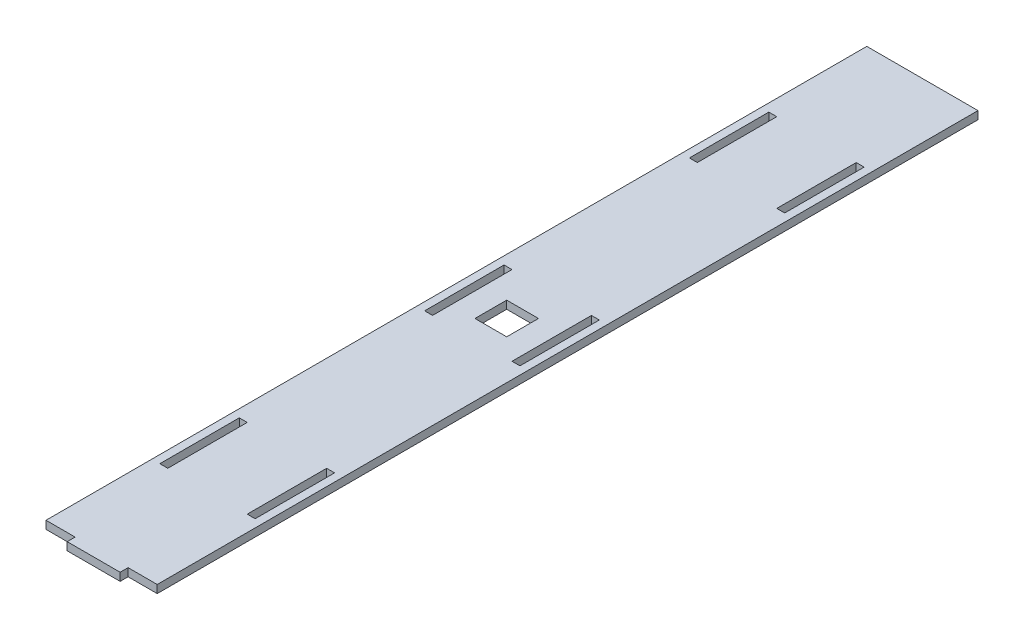
ISO-10303-21;
HEADER;
FILE_DESCRIPTION(('STEP AP214'),'2;1');
FILE_NAME('part.step','',(''),(''),'','','');
FILE_SCHEMA(('AUTOMOTIVE_DESIGN { 1 0 10303 214 1 1 1 1 }'));
ENDSEC;
DATA;
#1=APPLICATION_CONTEXT('core data for automotive mechanical design processes');
#2=APPLICATION_PROTOCOL_DEFINITION('international standard','automotive_design',2000,#1);
#3=PRODUCT_CONTEXT('',#1,'mechanical');
#4=PRODUCT('Part','Part','',(#3));
#5=PRODUCT_RELATED_PRODUCT_CATEGORY('part','',(#4));
#6=PRODUCT_DEFINITION_FORMATION('','',#4);
#7=PRODUCT_DEFINITION_CONTEXT('part definition',#1,'design');
#8=PRODUCT_DEFINITION('design','',#6,#7);
#9=PRODUCT_DEFINITION_SHAPE('','',#8);
#10=(LENGTH_UNIT() NAMED_UNIT(*) SI_UNIT(.MILLI.,.METRE.));
#11=(NAMED_UNIT(*) PLANE_ANGLE_UNIT() SI_UNIT($,.RADIAN.));
#12=(NAMED_UNIT(*) SI_UNIT($,.STERADIAN.) SOLID_ANGLE_UNIT());
#13=UNCERTAINTY_MEASURE_WITH_UNIT(LENGTH_MEASURE(1.E-05),#10,'distance_accuracy_value','');
#14=(GEOMETRIC_REPRESENTATION_CONTEXT(3) GLOBAL_UNCERTAINTY_ASSIGNED_CONTEXT((#13)) GLOBAL_UNIT_ASSIGNED_CONTEXT((#10,
#11,#12)) REPRESENTATION_CONTEXT('',''));
#15=CARTESIAN_POINT('',(0.,0.,0.));
#16=DIRECTION('',(0.,0.,1.));
#17=DIRECTION('',(1.,0.,0.));
#18=AXIS2_PLACEMENT_3D('',#15,#16,#17);
#19=CARTESIAN_POINT('',(0.,3.,0.));
#20=DIRECTION('',(0.,-1.,0.));
#21=DIRECTION('',(0.,0.,-1.));
#22=AXIS2_PLACEMENT_3D('',#19,#20,#21);
#23=PLANE('',#22);
#24=DIRECTION('',(-1.,0.,0.));
#25=VECTOR('',#24,1.);
#26=CARTESIAN_POINT('',(6.,3.,-70.));
#27=LINE('',#26,#25);
#28=CARTESIAN_POINT('',(6.,3.,-70.));
#29=VERTEX_POINT('',#28);
#30=CARTESIAN_POINT('',(3.,3.,-70.));
#31=VERTEX_POINT('',#30);
#32=EDGE_CURVE('E302',#29,#31,#27,.T.);
#33=ORIENTED_EDGE('',*,*,#32,.F.);
#34=DIRECTION('',(0.,0.,-1.));
#35=VECTOR('',#34,1.);
#36=CARTESIAN_POINT('',(6.,3.,-70.));
#37=LINE('',#36,#35);
#38=CARTESIAN_POINT('',(6.00000000000001,3.,-40.));
#39=VERTEX_POINT('',#38);
#40=EDGE_CURVE('E310',#39,#29,#37,.T.);
#41=ORIENTED_EDGE('',*,*,#40,.F.);
#42=DIRECTION('',(1.,0.,0.));
#43=VECTOR('',#42,1.);
#44=CARTESIAN_POINT('',(6.00000000000001,3.,-40.));
#45=LINE('',#44,#43);
#46=CARTESIAN_POINT('',(3.,3.,-40.));
#47=VERTEX_POINT('',#46);
#48=EDGE_CURVE('E307',#47,#39,#45,.T.);
#49=ORIENTED_EDGE('',*,*,#48,.F.);
#50=DIRECTION('',(0.,0.,1.));
#51=VECTOR('',#50,1.);
#52=CARTESIAN_POINT('',(3.,3.,-70.));
#53=LINE('',#52,#51);
#54=EDGE_CURVE('E304',#31,#47,#53,.T.);
#55=ORIENTED_EDGE('',*,*,#54,.F.);
#56=EDGE_LOOP('',(#33,#41,#49,#55));
#57=FACE_BOUND('',#56,.T.);
#58=DIRECTION('',(-1.,0.,0.));
#59=VECTOR('',#58,1.);
#60=CARTESIAN_POINT('',(5.99999999999998,3.,-270.));
#61=LINE('',#60,#59);
#62=CARTESIAN_POINT('',(5.99999999999998,3.,-270.));
#63=VERTEX_POINT('',#62);
#64=CARTESIAN_POINT('',(2.99999999999998,3.,-270.));
#65=VERTEX_POINT('',#64);
#66=EDGE_CURVE('E364',#63,#65,#61,.T.);
#67=ORIENTED_EDGE('',*,*,#66,.F.);
#68=DIRECTION('',(0.,0.,-1.));
#69=VECTOR('',#68,1.);
#70=CARTESIAN_POINT('',(5.99999999999998,3.,-270.));
#71=LINE('',#70,#69);
#72=CARTESIAN_POINT('',(5.99999999999998,3.,-240.));
#73=VERTEX_POINT('',#72);
#74=EDGE_CURVE('E372',#73,#63,#71,.T.);
#75=ORIENTED_EDGE('',*,*,#74,.F.);
#76=DIRECTION('',(1.,0.,0.));
#77=VECTOR('',#76,1.);
#78=CARTESIAN_POINT('',(5.99999999999998,3.,-240.));
#79=LINE('',#78,#77);
#80=CARTESIAN_POINT('',(2.99999999999998,3.,-240.));
#81=VERTEX_POINT('',#80);
#82=EDGE_CURVE('E369',#81,#73,#79,.T.);
#83=ORIENTED_EDGE('',*,*,#82,.F.);
#84=DIRECTION('',(0.,0.,1.));
#85=VECTOR('',#84,1.);
#86=CARTESIAN_POINT('',(2.99999999999998,3.,-270.));
#87=LINE('',#86,#85);
#88=EDGE_CURVE('E366',#65,#81,#87,.T.);
#89=ORIENTED_EDGE('',*,*,#88,.F.);
#90=EDGE_LOOP('',(#67,#75,#83,#89));
#91=FACE_BOUND('',#90,.T.);
#92=DIRECTION('',(0.,0.,1.));
#93=VECTOR('',#92,1.);
#94=CARTESIAN_POINT('',(36.,3.,-170.));
#95=LINE('',#94,#93);
#96=CARTESIAN_POINT('',(36.,3.,-170.));
#97=VERTEX_POINT('',#96);
#98=CARTESIAN_POINT('',(36.,3.,-140.));
#99=VERTEX_POINT('',#98);
#100=EDGE_CURVE('E426',#97,#99,#95,.T.);
#101=ORIENTED_EDGE('',*,*,#100,.F.);
#102=DIRECTION('',(-1.,0.,0.));
#103=VECTOR('',#102,1.);
#104=CARTESIAN_POINT('',(36.,3.,-170.));
#105=LINE('',#104,#103);
#106=CARTESIAN_POINT('',(39.,3.,-170.));
#107=VERTEX_POINT('',#106);
#108=EDGE_CURVE('E434',#107,#97,#105,.T.);
#109=ORIENTED_EDGE('',*,*,#108,.F.);
#110=DIRECTION('',(0.,0.,-1.));
#111=VECTOR('',#110,1.);
#112=CARTESIAN_POINT('',(39.,3.,-170.));
#113=LINE('',#112,#111);
#114=CARTESIAN_POINT('',(39.,3.,-140.));
#115=VERTEX_POINT('',#114);
#116=EDGE_CURVE('E431',#115,#107,#113,.T.);
#117=ORIENTED_EDGE('',*,*,#116,.F.);
#118=DIRECTION('',(1.,0.,0.));
#119=VECTOR('',#118,1.);
#120=CARTESIAN_POINT('',(36.,3.,-140.));
#121=LINE('',#120,#119);
#122=EDGE_CURVE('E428',#99,#115,#121,.T.);
#123=ORIENTED_EDGE('',*,*,#122,.F.);
#124=EDGE_LOOP('',(#101,#109,#117,#123));
#125=FACE_BOUND('',#124,.T.);
#126=DIRECTION('',(0.,0.,1.));
#127=VECTOR('',#126,1.);
#128=CARTESIAN_POINT('',(0.,3.,0.));
#129=LINE('',#128,#127);
#130=CARTESIAN_POINT('',(0.,3.,-310.));
#131=VERTEX_POINT('',#130);
#132=CARTESIAN_POINT('',(0.,3.,0.));
#133=VERTEX_POINT('',#132);
#134=EDGE_CURVE('E488',#131,#133,#129,.T.);
#135=ORIENTED_EDGE('',*,*,#134,.T.);
#136=DIRECTION('',(1.,0.,0.));
#137=VECTOR('',#136,1.);
#138=CARTESIAN_POINT('',(0.,3.,0.));
#139=LINE('',#138,#137);
#140=CARTESIAN_POINT('',(11.,3.,0.));
#141=VERTEX_POINT('',#140);
#142=EDGE_CURVE('E491',#133,#141,#139,.T.);
#143=ORIENTED_EDGE('',*,*,#142,.T.);
#144=DIRECTION('',(0.,0.,1.));
#145=VECTOR('',#144,1.);
#146=CARTESIAN_POINT('',(11.,3.,0.));
#147=LINE('',#146,#145);
#148=CARTESIAN_POINT('',(11.,3.,3.));
#149=VERTEX_POINT('',#148);
#150=EDGE_CURVE('E494',#141,#149,#147,.T.);
#151=ORIENTED_EDGE('',*,*,#150,.T.);
#152=DIRECTION('',(1.,0.,0.));
#153=VECTOR('',#152,1.);
#154=CARTESIAN_POINT('',(11.,3.,3.));
#155=LINE('',#154,#153);
#156=CARTESIAN_POINT('',(31.,3.,3.));
#157=VERTEX_POINT('',#156);
#158=EDGE_CURVE('E496',#149,#157,#155,.T.);
#159=ORIENTED_EDGE('',*,*,#158,.T.);
#160=DIRECTION('',(0.,0.,-1.));
#161=VECTOR('',#160,1.);
#162=CARTESIAN_POINT('',(31.,3.,0.));
#163=LINE('',#162,#161);
#164=CARTESIAN_POINT('',(31.,3.,0.));
#165=VERTEX_POINT('',#164);
#166=EDGE_CURVE('E498',#157,#165,#163,.T.);
#167=ORIENTED_EDGE('',*,*,#166,.T.);
#168=DIRECTION('',(1.,0.,0.));
#169=VECTOR('',#168,1.);
#170=CARTESIAN_POINT('',(31.,3.,0.));
#171=LINE('',#170,#169);
#172=CARTESIAN_POINT('',(42.,3.,0.));
#173=VERTEX_POINT('',#172);
#174=EDGE_CURVE('E500',#165,#173,#171,.T.);
#175=ORIENTED_EDGE('',*,*,#174,.T.);
#176=DIRECTION('',(0.,0.,-1.));
#177=VECTOR('',#176,1.);
#178=CARTESIAN_POINT('',(42.,3.,0.));
#179=LINE('',#178,#177);
#180=CARTESIAN_POINT('',(41.9999999999999,3.,-310.));
#181=VERTEX_POINT('',#180);
#182=EDGE_CURVE('E502',#173,#181,#179,.T.);
#183=ORIENTED_EDGE('',*,*,#182,.T.);
#184=DIRECTION('',(-1.,0.,0.));
#185=VECTOR('',#184,1.);
#186=CARTESIAN_POINT('',(0.,3.,-310.));
#187=LINE('',#186,#185);
#188=EDGE_CURVE('E504',#181,#131,#187,.T.);
#189=ORIENTED_EDGE('',*,*,#188,.T.);
#190=EDGE_LOOP('',(#135,#143,#151,#159,#167,#175,#183,#189));
#191=FACE_BOUND('',#190,.T.);
#192=DIRECTION('',(0.,0.,1.));
#193=VECTOR('',#192,1.);
#194=CARTESIAN_POINT('',(36.,3.,-70.));
#195=LINE('',#194,#193);
#196=CARTESIAN_POINT('',(36.,3.,-70.));
#197=VERTEX_POINT('',#196);
#198=CARTESIAN_POINT('',(36.,3.,-40.));
#199=VERTEX_POINT('',#198);
#200=EDGE_CURVE('E457',#197,#199,#195,.T.);
#201=ORIENTED_EDGE('',*,*,#200,.F.);
#202=DIRECTION('',(-1.,0.,0.));
#203=VECTOR('',#202,1.);
#204=CARTESIAN_POINT('',(36.,3.,-70.));
#205=LINE('',#204,#203);
#206=CARTESIAN_POINT('',(39.,3.,-70.));
#207=VERTEX_POINT('',#206);
#208=EDGE_CURVE('E465',#207,#197,#205,.T.);
#209=ORIENTED_EDGE('',*,*,#208,.F.);
#210=DIRECTION('',(0.,0.,-1.));
#211=VECTOR('',#210,1.);
#212=CARTESIAN_POINT('',(39.,3.,-70.));
#213=LINE('',#212,#211);
#214=CARTESIAN_POINT('',(39.,3.,-40.));
#215=VERTEX_POINT('',#214);
#216=EDGE_CURVE('E462',#215,#207,#213,.T.);
#217=ORIENTED_EDGE('',*,*,#216,.F.);
#218=DIRECTION('',(1.,0.,0.));
#219=VECTOR('',#218,1.);
#220=CARTESIAN_POINT('',(36.,3.,-40.));
#221=LINE('',#220,#219);
#222=EDGE_CURVE('E459',#199,#215,#221,.T.);
#223=ORIENTED_EDGE('',*,*,#222,.F.);
#224=EDGE_LOOP('',(#201,#209,#217,#223));
#225=FACE_BOUND('',#224,.T.);
#226=DIRECTION('',(0.,0.,1.));
#227=VECTOR('',#226,1.);
#228=CARTESIAN_POINT('',(36.,3.,-270.));
#229=LINE('',#228,#227);
#230=CARTESIAN_POINT('',(36.,3.,-270.));
#231=VERTEX_POINT('',#230);
#232=CARTESIAN_POINT('',(36.,3.,-240.));
#233=VERTEX_POINT('',#232);
#234=EDGE_CURVE('E395',#231,#233,#229,.T.);
#235=ORIENTED_EDGE('',*,*,#234,.F.);
#236=DIRECTION('',(-1.,0.,0.));
#237=VECTOR('',#236,1.);
#238=CARTESIAN_POINT('',(36.,3.,-270.));
#239=LINE('',#238,#237);
#240=CARTESIAN_POINT('',(39.,3.,-270.));
#241=VERTEX_POINT('',#240);
#242=EDGE_CURVE('E403',#241,#231,#239,.T.);
#243=ORIENTED_EDGE('',*,*,#242,.F.);
#244=DIRECTION('',(0.,0.,-1.));
#245=VECTOR('',#244,1.);
#246=CARTESIAN_POINT('',(39.,3.,-270.));
#247=LINE('',#246,#245);
#248=CARTESIAN_POINT('',(39.,3.,-240.));
#249=VERTEX_POINT('',#248);
#250=EDGE_CURVE('E400',#249,#241,#247,.T.);
#251=ORIENTED_EDGE('',*,*,#250,.F.);
#252=DIRECTION('',(1.,0.,0.));
#253=VECTOR('',#252,1.);
#254=CARTESIAN_POINT('',(36.,3.,-240.));
#255=LINE('',#254,#253);
#256=EDGE_CURVE('E397',#233,#249,#255,.T.);
#257=ORIENTED_EDGE('',*,*,#256,.F.);
#258=EDGE_LOOP('',(#235,#243,#251,#257));
#259=FACE_BOUND('',#258,.T.);
#260=DIRECTION('',(-1.,0.,0.));
#261=VECTOR('',#260,1.);
#262=CARTESIAN_POINT('',(6.,3.,-170.));
#263=LINE('',#262,#261);
#264=CARTESIAN_POINT('',(6.,3.,-170.));
#265=VERTEX_POINT('',#264);
#266=CARTESIAN_POINT('',(3.,3.,-170.));
#267=VERTEX_POINT('',#266);
#268=EDGE_CURVE('E333',#265,#267,#263,.T.);
#269=ORIENTED_EDGE('',*,*,#268,.F.);
#270=DIRECTION('',(0.,0.,-1.));
#271=VECTOR('',#270,1.);
#272=CARTESIAN_POINT('',(6.,3.,-170.));
#273=LINE('',#272,#271);
#274=CARTESIAN_POINT('',(6.,3.,-140.));
#275=VERTEX_POINT('',#274);
#276=EDGE_CURVE('E341',#275,#265,#273,.T.);
#277=ORIENTED_EDGE('',*,*,#276,.F.);
#278=DIRECTION('',(1.,0.,0.));
#279=VECTOR('',#278,1.);
#280=CARTESIAN_POINT('',(6.,3.,-140.));
#281=LINE('',#280,#279);
#282=CARTESIAN_POINT('',(2.99999999999999,3.,-140.));
#283=VERTEX_POINT('',#282);
#284=EDGE_CURVE('E338',#283,#275,#281,.T.);
#285=ORIENTED_EDGE('',*,*,#284,.F.);
#286=DIRECTION('',(0.,0.,1.));
#287=VECTOR('',#286,1.);
#288=CARTESIAN_POINT('',(3.,3.,-170.));
#289=LINE('',#288,#287);
#290=EDGE_CURVE('E335',#267,#283,#289,.T.);
#291=ORIENTED_EDGE('',*,*,#290,.F.);
#292=EDGE_LOOP('',(#269,#277,#285,#291));
#293=FACE_BOUND('',#292,.T.);
#294=DIRECTION('',(0.,0.,1.));
#295=VECTOR('',#294,1.);
#296=CARTESIAN_POINT('',(15.,3.,-159.));
#297=LINE('',#296,#295);
#298=CARTESIAN_POINT('',(15.,3.,-159.));
#299=VERTEX_POINT('',#298);
#300=CARTESIAN_POINT('',(15.,3.,-147.));
#301=VERTEX_POINT('',#300);
#302=EDGE_CURVE('E266',#299,#301,#297,.T.);
#303=ORIENTED_EDGE('',*,*,#302,.F.);
#304=DIRECTION('',(-1.,0.,0.));
#305=VECTOR('',#304,1.);
#306=CARTESIAN_POINT('',(15.,3.,-159.));
#307=LINE('',#306,#305);
#308=CARTESIAN_POINT('',(27.,3.,-159.));
#309=VERTEX_POINT('',#308);
#310=EDGE_CURVE('E288',#309,#299,#307,.T.);
#311=ORIENTED_EDGE('',*,*,#310,.F.);
#312=DIRECTION('',(0.,0.,-1.));
#313=VECTOR('',#312,1.);
#314=CARTESIAN_POINT('',(27.,3.,-159.));
#315=LINE('',#314,#313);
#316=CARTESIAN_POINT('',(27.,3.,-147.));
#317=VERTEX_POINT('',#316);
#318=EDGE_CURVE('E286',#317,#309,#315,.T.);
#319=ORIENTED_EDGE('',*,*,#318,.F.);
#320=DIRECTION('',(1.,0.,0.));
#321=VECTOR('',#320,1.);
#322=CARTESIAN_POINT('',(15.,3.,-147.));
#323=LINE('',#322,#321);
#324=EDGE_CURVE('E274',#301,#317,#323,.T.);
#325=ORIENTED_EDGE('',*,*,#324,.F.);
#326=EDGE_LOOP('',(#303,#311,#319,#325));
#327=FACE_BOUND('',#326,.T.);
#328=ADVANCED_FACE('F33',(#57,#91,#125,#191,#225,#259,#293,#327),#23,.F.);
#329=CARTESIAN_POINT('',(0.,0.,0.));
#330=DIRECTION('',(0.,-1.,0.));
#331=DIRECTION('',(0.,0.,-1.));
#332=AXIS2_PLACEMENT_3D('',#329,#330,#331);
#333=PLANE('',#332);
#334=DIRECTION('',(0.,0.,1.));
#335=VECTOR('',#334,1.);
#336=CARTESIAN_POINT('',(0.,0.,0.));
#337=LINE('',#336,#335);
#338=CARTESIAN_POINT('',(0.,0.,-310.));
#339=VERTEX_POINT('',#338);
#340=CARTESIAN_POINT('',(0.,0.,0.));
#341=VERTEX_POINT('',#340);
#342=EDGE_CURVE('E487',#339,#341,#337,.T.);
#343=ORIENTED_EDGE('',*,*,#342,.F.);
#344=DIRECTION('',(-1.,0.,0.));
#345=VECTOR('',#344,1.);
#346=CARTESIAN_POINT('',(0.,0.,-310.));
#347=LINE('',#346,#345);
#348=CARTESIAN_POINT('',(41.9999999999999,0.,-310.));
#349=VERTEX_POINT('',#348);
#350=EDGE_CURVE('E492',#349,#339,#347,.T.);
#351=ORIENTED_EDGE('',*,*,#350,.F.);
#352=DIRECTION('',(0.,0.,-1.));
#353=VECTOR('',#352,1.);
#354=CARTESIAN_POINT('',(42.,0.,0.));
#355=LINE('',#354,#353);
#356=CARTESIAN_POINT('',(42.,0.,0.));
#357=VERTEX_POINT('',#356);
#358=EDGE_CURVE('E519',#357,#349,#355,.T.);
#359=ORIENTED_EDGE('',*,*,#358,.F.);
#360=DIRECTION('',(1.,0.,0.));
#361=VECTOR('',#360,1.);
#362=CARTESIAN_POINT('',(31.,0.,0.));
#363=LINE('',#362,#361);
#364=CARTESIAN_POINT('',(31.,0.,0.));
#365=VERTEX_POINT('',#364);
#366=EDGE_CURVE('E517',#365,#357,#363,.T.);
#367=ORIENTED_EDGE('',*,*,#366,.F.);
#368=DIRECTION('',(0.,0.,-1.));
#369=VECTOR('',#368,1.);
#370=CARTESIAN_POINT('',(31.,0.,0.));
#371=LINE('',#370,#369);
#372=CARTESIAN_POINT('',(31.,0.,3.));
#373=VERTEX_POINT('',#372);
#374=EDGE_CURVE('E515',#373,#365,#371,.T.);
#375=ORIENTED_EDGE('',*,*,#374,.F.);
#376=DIRECTION('',(1.,0.,0.));
#377=VECTOR('',#376,1.);
#378=CARTESIAN_POINT('',(11.,0.,3.));
#379=LINE('',#378,#377);
#380=CARTESIAN_POINT('',(11.,0.,3.));
#381=VERTEX_POINT('',#380);
#382=EDGE_CURVE('E513',#381,#373,#379,.T.);
#383=ORIENTED_EDGE('',*,*,#382,.F.);
#384=DIRECTION('',(0.,0.,1.));
#385=VECTOR('',#384,1.);
#386=CARTESIAN_POINT('',(11.,0.,0.));
#387=LINE('',#386,#385);
#388=CARTESIAN_POINT('',(11.,0.,0.));
#389=VERTEX_POINT('',#388);
#390=EDGE_CURVE('E511',#389,#381,#387,.T.);
#391=ORIENTED_EDGE('',*,*,#390,.F.);
#392=DIRECTION('',(1.,0.,0.));
#393=VECTOR('',#392,1.);
#394=CARTESIAN_POINT('',(0.,0.,0.));
#395=LINE('',#394,#393);
#396=EDGE_CURVE('E509',#341,#389,#395,.T.);
#397=ORIENTED_EDGE('',*,*,#396,.F.);
#398=EDGE_LOOP('',(#343,#351,#359,#367,#375,#383,#391,#397));
#399=FACE_BOUND('',#398,.T.);
#400=DIRECTION('',(-1.,0.,0.));
#401=VECTOR('',#400,1.);
#402=CARTESIAN_POINT('',(36.,0.,-70.));
#403=LINE('',#402,#401);
#404=CARTESIAN_POINT('',(39.,0.,-70.));
#405=VERTEX_POINT('',#404);
#406=CARTESIAN_POINT('',(36.,0.,-70.));
#407=VERTEX_POINT('',#406);
#408=EDGE_CURVE('E460',#405,#407,#403,.T.);
#409=ORIENTED_EDGE('',*,*,#408,.T.);
#410=DIRECTION('',(0.,0.,1.));
#411=VECTOR('',#410,1.);
#412=CARTESIAN_POINT('',(36.,0.,-70.));
#413=LINE('',#412,#411);
#414=CARTESIAN_POINT('',(36.,0.,-40.));
#415=VERTEX_POINT('',#414);
#416=EDGE_CURVE('E456',#407,#415,#413,.T.);
#417=ORIENTED_EDGE('',*,*,#416,.T.);
#418=DIRECTION('',(1.,0.,0.));
#419=VECTOR('',#418,1.);
#420=CARTESIAN_POINT('',(36.,0.,-40.));
#421=LINE('',#420,#419);
#422=CARTESIAN_POINT('',(39.,0.,-40.));
#423=VERTEX_POINT('',#422);
#424=EDGE_CURVE('E470',#415,#423,#421,.T.);
#425=ORIENTED_EDGE('',*,*,#424,.T.);
#426=DIRECTION('',(0.,0.,-1.));
#427=VECTOR('',#426,1.);
#428=CARTESIAN_POINT('',(39.,0.,-70.));
#429=LINE('',#428,#427);
#430=EDGE_CURVE('E473',#423,#405,#429,.T.);
#431=ORIENTED_EDGE('',*,*,#430,.T.);
#432=EDGE_LOOP('',(#409,#417,#425,#431));
#433=FACE_BOUND('',#432,.T.);
#434=DIRECTION('',(-1.,0.,0.));
#435=VECTOR('',#434,1.);
#436=CARTESIAN_POINT('',(36.,0.,-170.));
#437=LINE('',#436,#435);
#438=CARTESIAN_POINT('',(39.,0.,-170.));
#439=VERTEX_POINT('',#438);
#440=CARTESIAN_POINT('',(36.,0.,-170.));
#441=VERTEX_POINT('',#440);
#442=EDGE_CURVE('E429',#439,#441,#437,.T.);
#443=ORIENTED_EDGE('',*,*,#442,.T.);
#444=DIRECTION('',(0.,0.,1.));
#445=VECTOR('',#444,1.);
#446=CARTESIAN_POINT('',(36.,0.,-170.));
#447=LINE('',#446,#445);
#448=CARTESIAN_POINT('',(36.,0.,-140.));
#449=VERTEX_POINT('',#448);
#450=EDGE_CURVE('E425',#441,#449,#447,.T.);
#451=ORIENTED_EDGE('',*,*,#450,.T.);
#452=DIRECTION('',(1.,0.,0.));
#453=VECTOR('',#452,1.);
#454=CARTESIAN_POINT('',(36.,0.,-140.));
#455=LINE('',#454,#453);
#456=CARTESIAN_POINT('',(39.,0.,-140.));
#457=VERTEX_POINT('',#456);
#458=EDGE_CURVE('E439',#449,#457,#455,.T.);
#459=ORIENTED_EDGE('',*,*,#458,.T.);
#460=DIRECTION('',(0.,0.,-1.));
#461=VECTOR('',#460,1.);
#462=CARTESIAN_POINT('',(39.,0.,-170.));
#463=LINE('',#462,#461);
#464=EDGE_CURVE('E442',#457,#439,#463,.T.);
#465=ORIENTED_EDGE('',*,*,#464,.T.);
#466=EDGE_LOOP('',(#443,#451,#459,#465));
#467=FACE_BOUND('',#466,.T.);
#468=DIRECTION('',(-1.,0.,0.));
#469=VECTOR('',#468,1.);
#470=CARTESIAN_POINT('',(36.,0.,-270.));
#471=LINE('',#470,#469);
#472=CARTESIAN_POINT('',(39.,0.,-270.));
#473=VERTEX_POINT('',#472);
#474=CARTESIAN_POINT('',(36.,0.,-270.));
#475=VERTEX_POINT('',#474);
#476=EDGE_CURVE('E398',#473,#475,#471,.T.);
#477=ORIENTED_EDGE('',*,*,#476,.T.);
#478=DIRECTION('',(0.,0.,1.));
#479=VECTOR('',#478,1.);
#480=CARTESIAN_POINT('',(36.,0.,-270.));
#481=LINE('',#480,#479);
#482=CARTESIAN_POINT('',(36.,0.,-240.));
#483=VERTEX_POINT('',#482);
#484=EDGE_CURVE('E394',#475,#483,#481,.T.);
#485=ORIENTED_EDGE('',*,*,#484,.T.);
#486=DIRECTION('',(1.,0.,0.));
#487=VECTOR('',#486,1.);
#488=CARTESIAN_POINT('',(36.,0.,-240.));
#489=LINE('',#488,#487);
#490=CARTESIAN_POINT('',(39.,0.,-240.));
#491=VERTEX_POINT('',#490);
#492=EDGE_CURVE('E408',#483,#491,#489,.T.);
#493=ORIENTED_EDGE('',*,*,#492,.T.);
#494=DIRECTION('',(0.,0.,-1.));
#495=VECTOR('',#494,1.);
#496=CARTESIAN_POINT('',(39.,0.,-270.));
#497=LINE('',#496,#495);
#498=EDGE_CURVE('E411',#491,#473,#497,.T.);
#499=ORIENTED_EDGE('',*,*,#498,.T.);
#500=EDGE_LOOP('',(#477,#485,#493,#499));
#501=FACE_BOUND('',#500,.T.);
#502=DIRECTION('',(0.,0.,-1.));
#503=VECTOR('',#502,1.);
#504=CARTESIAN_POINT('',(5.99999999999998,0.,-270.));
#505=LINE('',#504,#503);
#506=CARTESIAN_POINT('',(5.99999999999998,0.,-240.));
#507=VERTEX_POINT('',#506);
#508=CARTESIAN_POINT('',(5.99999999999998,0.,-270.));
#509=VERTEX_POINT('',#508);
#510=EDGE_CURVE('E367',#507,#509,#505,.T.);
#511=ORIENTED_EDGE('',*,*,#510,.T.);
#512=DIRECTION('',(-1.,0.,0.));
#513=VECTOR('',#512,1.);
#514=CARTESIAN_POINT('',(5.99999999999998,0.,-270.));
#515=LINE('',#514,#513);
#516=CARTESIAN_POINT('',(2.99999999999998,0.,-270.));
#517=VERTEX_POINT('',#516);
#518=EDGE_CURVE('E363',#509,#517,#515,.T.);
#519=ORIENTED_EDGE('',*,*,#518,.T.);
#520=DIRECTION('',(0.,0.,1.));
#521=VECTOR('',#520,1.);
#522=CARTESIAN_POINT('',(2.99999999999998,0.,-270.));
#523=LINE('',#522,#521);
#524=CARTESIAN_POINT('',(2.99999999999998,0.,-240.));
#525=VERTEX_POINT('',#524);
#526=EDGE_CURVE('E377',#517,#525,#523,.T.);
#527=ORIENTED_EDGE('',*,*,#526,.T.);
#528=DIRECTION('',(1.,0.,0.));
#529=VECTOR('',#528,1.);
#530=CARTESIAN_POINT('',(5.99999999999998,0.,-240.));
#531=LINE('',#530,#529);
#532=EDGE_CURVE('E380',#525,#507,#531,.T.);
#533=ORIENTED_EDGE('',*,*,#532,.T.);
#534=EDGE_LOOP('',(#511,#519,#527,#533));
#535=FACE_BOUND('',#534,.T.);
#536=DIRECTION('',(0.,0.,-1.));
#537=VECTOR('',#536,1.);
#538=CARTESIAN_POINT('',(6.,0.,-170.));
#539=LINE('',#538,#537);
#540=CARTESIAN_POINT('',(6.,0.,-140.));
#541=VERTEX_POINT('',#540);
#542=CARTESIAN_POINT('',(6.,0.,-170.));
#543=VERTEX_POINT('',#542);
#544=EDGE_CURVE('E336',#541,#543,#539,.T.);
#545=ORIENTED_EDGE('',*,*,#544,.T.);
#546=DIRECTION('',(-1.,0.,0.));
#547=VECTOR('',#546,1.);
#548=CARTESIAN_POINT('',(6.,0.,-170.));
#549=LINE('',#548,#547);
#550=CARTESIAN_POINT('',(3.,0.,-170.));
#551=VERTEX_POINT('',#550);
#552=EDGE_CURVE('E332',#543,#551,#549,.T.);
#553=ORIENTED_EDGE('',*,*,#552,.T.);
#554=DIRECTION('',(0.,0.,1.));
#555=VECTOR('',#554,1.);
#556=CARTESIAN_POINT('',(3.,0.,-170.));
#557=LINE('',#556,#555);
#558=CARTESIAN_POINT('',(2.99999999999999,0.,-140.));
#559=VERTEX_POINT('',#558);
#560=EDGE_CURVE('E346',#551,#559,#557,.T.);
#561=ORIENTED_EDGE('',*,*,#560,.T.);
#562=DIRECTION('',(1.,0.,0.));
#563=VECTOR('',#562,1.);
#564=CARTESIAN_POINT('',(6.,0.,-140.));
#565=LINE('',#564,#563);
#566=EDGE_CURVE('E349',#559,#541,#565,.T.);
#567=ORIENTED_EDGE('',*,*,#566,.T.);
#568=EDGE_LOOP('',(#545,#553,#561,#567));
#569=FACE_BOUND('',#568,.T.);
#570=DIRECTION('',(0.,0.,-1.));
#571=VECTOR('',#570,1.);
#572=CARTESIAN_POINT('',(6.,0.,-70.));
#573=LINE('',#572,#571);
#574=CARTESIAN_POINT('',(6.00000000000001,0.,-40.));
#575=VERTEX_POINT('',#574);
#576=CARTESIAN_POINT('',(6.,0.,-70.));
#577=VERTEX_POINT('',#576);
#578=EDGE_CURVE('E305',#575,#577,#573,.T.);
#579=ORIENTED_EDGE('',*,*,#578,.T.);
#580=DIRECTION('',(-1.,0.,0.));
#581=VECTOR('',#580,1.);
#582=CARTESIAN_POINT('',(6.,0.,-70.));
#583=LINE('',#582,#581);
#584=CARTESIAN_POINT('',(3.,0.,-70.));
#585=VERTEX_POINT('',#584);
#586=EDGE_CURVE('E282',#577,#585,#583,.T.);
#587=ORIENTED_EDGE('',*,*,#586,.T.);
#588=DIRECTION('',(0.,0.,1.));
#589=VECTOR('',#588,1.);
#590=CARTESIAN_POINT('',(3.,0.,-70.));
#591=LINE('',#590,#589);
#592=CARTESIAN_POINT('',(3.,0.,-40.));
#593=VERTEX_POINT('',#592);
#594=EDGE_CURVE('E315',#585,#593,#591,.T.);
#595=ORIENTED_EDGE('',*,*,#594,.T.);
#596=DIRECTION('',(1.,0.,0.));
#597=VECTOR('',#596,1.);
#598=CARTESIAN_POINT('',(6.00000000000001,0.,-40.));
#599=LINE('',#598,#597);
#600=EDGE_CURVE('E318',#593,#575,#599,.T.);
#601=ORIENTED_EDGE('',*,*,#600,.T.);
#602=EDGE_LOOP('',(#579,#587,#595,#601));
#603=FACE_BOUND('',#602,.T.);
#604=DIRECTION('',(-1.,0.,0.));
#605=VECTOR('',#604,1.);
#606=CARTESIAN_POINT('',(15.,0.,-159.));
#607=LINE('',#606,#605);
#608=CARTESIAN_POINT('',(27.,0.,-159.));
#609=VERTEX_POINT('',#608);
#610=CARTESIAN_POINT('',(15.,0.,-159.));
#611=VERTEX_POINT('',#610);
#612=EDGE_CURVE('E275',#609,#611,#607,.T.);
#613=ORIENTED_EDGE('',*,*,#612,.T.);
#614=DIRECTION('',(0.,0.,1.));
#615=VECTOR('',#614,1.);
#616=CARTESIAN_POINT('',(15.,0.,-159.));
#617=LINE('',#616,#615);
#618=CARTESIAN_POINT('',(15.,0.,-147.));
#619=VERTEX_POINT('',#618);
#620=EDGE_CURVE('E56',#611,#619,#617,.T.);
#621=ORIENTED_EDGE('',*,*,#620,.T.);
#622=DIRECTION('',(1.,0.,0.));
#623=VECTOR('',#622,1.);
#624=CARTESIAN_POINT('',(15.,0.,-147.));
#625=LINE('',#624,#623);
#626=CARTESIAN_POINT('',(27.,0.,-147.));
#627=VERTEX_POINT('',#626);
#628=EDGE_CURVE('E281',#619,#627,#625,.T.);
#629=ORIENTED_EDGE('',*,*,#628,.T.);
#630=DIRECTION('',(0.,0.,-1.));
#631=VECTOR('',#630,1.);
#632=CARTESIAN_POINT('',(27.,0.,-159.));
#633=LINE('',#632,#631);
#634=EDGE_CURVE('E294',#627,#609,#633,.T.);
#635=ORIENTED_EDGE('',*,*,#634,.T.);
#636=EDGE_LOOP('',(#613,#621,#629,#635));
#637=FACE_BOUND('',#636,.T.);
#638=ADVANCED_FACE('F549',(#399,#433,#467,#501,#535,#569,#603,#637),#333,.T.);
#639=CARTESIAN_POINT('',(0.,3.,0.));
#640=DIRECTION('',(1.,0.,0.));
#641=DIRECTION('',(0.,0.,-1.));
#642=AXIS2_PLACEMENT_3D('',#639,#640,#641);
#643=PLANE('',#642);
#644=ORIENTED_EDGE('',*,*,#342,.T.);
#645=DIRECTION('',(0.,-1.,0.));
#646=VECTOR('',#645,1.);
#647=CARTESIAN_POINT('',(0.,3.,0.));
#648=LINE('',#647,#646);
#649=EDGE_CURVE('E11',#133,#341,#648,.T.);
#650=ORIENTED_EDGE('',*,*,#649,.F.);
#651=ORIENTED_EDGE('',*,*,#134,.F.);
#652=DIRECTION('',(0.,-1.,0.));
#653=VECTOR('',#652,1.);
#654=CARTESIAN_POINT('',(0.,3.,-310.));
#655=LINE('',#654,#653);
#656=EDGE_CURVE('E506',#131,#339,#655,.T.);
#657=ORIENTED_EDGE('',*,*,#656,.T.);
#658=EDGE_LOOP('',(#644,#650,#651,#657));
#659=FACE_BOUND('',#658,.T.);
#660=ADVANCED_FACE('F35',(#659),#643,.F.);
#661=CARTESIAN_POINT('',(0.,3.,0.));
#662=DIRECTION('',(0.,0.,-1.));
#663=DIRECTION('',(-1.,0.,0.));
#664=AXIS2_PLACEMENT_3D('',#661,#662,#663);
#665=PLANE('',#664);
#666=ORIENTED_EDGE('',*,*,#396,.T.);
#667=DIRECTION('',(0.,-1.,0.));
#668=VECTOR('',#667,1.);
#669=CARTESIAN_POINT('',(11.,3.,0.));
#670=LINE('',#669,#668);
#671=EDGE_CURVE('E41',#141,#389,#670,.T.);
#672=ORIENTED_EDGE('',*,*,#671,.F.);
#673=ORIENTED_EDGE('',*,*,#142,.F.);
#674=ORIENTED_EDGE('',*,*,#649,.T.);
#675=EDGE_LOOP('',(#666,#672,#673,#674));
#676=FACE_BOUND('',#675,.T.);
#677=ADVANCED_FACE('F567',(#676),#665,.F.);
#678=CARTESIAN_POINT('',(11.,3.,0.));
#679=DIRECTION('',(1.,0.,0.));
#680=DIRECTION('',(0.,0.,-1.));
#681=AXIS2_PLACEMENT_3D('',#678,#679,#680);
#682=PLANE('',#681);
#683=ORIENTED_EDGE('',*,*,#390,.T.);
#684=DIRECTION('',(0.,-1.,0.));
#685=VECTOR('',#684,1.);
#686=CARTESIAN_POINT('',(11.,3.,3.));
#687=LINE('',#686,#685);
#688=EDGE_CURVE('E536',#149,#381,#687,.T.);
#689=ORIENTED_EDGE('',*,*,#688,.F.);
#690=ORIENTED_EDGE('',*,*,#150,.F.);
#691=ORIENTED_EDGE('',*,*,#671,.T.);
#692=EDGE_LOOP('',(#683,#689,#690,#691));
#693=FACE_BOUND('',#692,.T.);
#694=ADVANCED_FACE('F543',(#693),#682,.F.);
#695=CARTESIAN_POINT('',(11.,3.,3.));
#696=DIRECTION('',(0.,0.,-1.));
#697=DIRECTION('',(-1.,0.,0.));
#698=AXIS2_PLACEMENT_3D('',#695,#696,#697);
#699=PLANE('',#698);
#700=ORIENTED_EDGE('',*,*,#382,.T.);
#701=DIRECTION('',(0.,-1.,0.));
#702=VECTOR('',#701,1.);
#703=CARTESIAN_POINT('',(31.,3.,3.));
#704=LINE('',#703,#702);
#705=EDGE_CURVE('E533',#157,#373,#704,.T.);
#706=ORIENTED_EDGE('',*,*,#705,.F.);
#707=ORIENTED_EDGE('',*,*,#158,.F.);
#708=ORIENTED_EDGE('',*,*,#688,.T.);
#709=EDGE_LOOP('',(#700,#706,#707,#708));
#710=FACE_BOUND('',#709,.T.);
#711=ADVANCED_FACE('F555',(#710),#699,.F.);
#712=CARTESIAN_POINT('',(31.,3.,0.));
#713=DIRECTION('',(-1.,0.,0.));
#714=DIRECTION('',(0.,0.,1.));
#715=AXIS2_PLACEMENT_3D('',#712,#713,#714);
#716=PLANE('',#715);
#717=ORIENTED_EDGE('',*,*,#374,.T.);
#718=DIRECTION('',(0.,-1.,0.));
#719=VECTOR('',#718,1.);
#720=CARTESIAN_POINT('',(31.,3.,0.));
#721=LINE('',#720,#719);
#722=EDGE_CURVE('E530',#165,#365,#721,.T.);
#723=ORIENTED_EDGE('',*,*,#722,.F.);
#724=ORIENTED_EDGE('',*,*,#166,.F.);
#725=ORIENTED_EDGE('',*,*,#705,.T.);
#726=EDGE_LOOP('',(#717,#723,#724,#725));
#727=FACE_BOUND('',#726,.T.);
#728=ADVANCED_FACE('F559',(#727),#716,.F.);
#729=CARTESIAN_POINT('',(31.,3.,0.));
#730=DIRECTION('',(0.,0.,-1.));
#731=DIRECTION('',(-1.,0.,0.));
#732=AXIS2_PLACEMENT_3D('',#729,#730,#731);
#733=PLANE('',#732);
#734=ORIENTED_EDGE('',*,*,#366,.T.);
#735=DIRECTION('',(0.,-1.,0.));
#736=VECTOR('',#735,1.);
#737=CARTESIAN_POINT('',(42.,3.,0.));
#738=LINE('',#737,#736);
#739=EDGE_CURVE('E527',#173,#357,#738,.T.);
#740=ORIENTED_EDGE('',*,*,#739,.F.);
#741=ORIENTED_EDGE('',*,*,#174,.F.);
#742=ORIENTED_EDGE('',*,*,#722,.T.);
#743=EDGE_LOOP('',(#734,#740,#741,#742));
#744=FACE_BOUND('',#743,.T.);
#745=ADVANCED_FACE('F580',(#744),#733,.F.);
#746=CARTESIAN_POINT('',(42.,3.,0.));
#747=DIRECTION('',(-1.,0.,0.));
#748=DIRECTION('',(0.,0.,1.));
#749=AXIS2_PLACEMENT_3D('',#746,#747,#748);
#750=PLANE('',#749);
#751=ORIENTED_EDGE('',*,*,#358,.T.);
#752=DIRECTION('',(0.,-1.,0.));
#753=VECTOR('',#752,1.);
#754=CARTESIAN_POINT('',(41.9999999999999,3.,-310.));
#755=LINE('',#754,#753);
#756=EDGE_CURVE('E524',#181,#349,#755,.T.);
#757=ORIENTED_EDGE('',*,*,#756,.F.);
#758=ORIENTED_EDGE('',*,*,#182,.F.);
#759=ORIENTED_EDGE('',*,*,#739,.T.);
#760=EDGE_LOOP('',(#751,#757,#758,#759));
#761=FACE_BOUND('',#760,.T.);
#762=ADVANCED_FACE('F578',(#761),#750,.F.);
#763=CARTESIAN_POINT('',(0.,3.,-310.));
#764=DIRECTION('',(0.,0.,1.));
#765=DIRECTION('',(1.,0.,0.));
#766=AXIS2_PLACEMENT_3D('',#763,#764,#765);
#767=PLANE('',#766);
#768=ORIENTED_EDGE('',*,*,#350,.T.);
#769=ORIENTED_EDGE('',*,*,#656,.F.);
#770=ORIENTED_EDGE('',*,*,#188,.F.);
#771=ORIENTED_EDGE('',*,*,#756,.T.);
#772=EDGE_LOOP('',(#768,#769,#770,#771));
#773=FACE_BOUND('',#772,.T.);
#774=ADVANCED_FACE('F573',(#773),#767,.F.);
#775=CARTESIAN_POINT('',(36.,3.,-70.));
#776=DIRECTION('',(1.,0.,0.));
#777=DIRECTION('',(0.,0.,-1.));
#778=AXIS2_PLACEMENT_3D('',#775,#776,#777);
#779=PLANE('',#778);
#780=ORIENTED_EDGE('',*,*,#416,.F.);
#781=DIRECTION('',(0.,-1.,0.));
#782=VECTOR('',#781,1.);
#783=CARTESIAN_POINT('',(36.,3.,-70.));
#784=LINE('',#783,#782);
#785=EDGE_CURVE('E467',#197,#407,#784,.T.);
#786=ORIENTED_EDGE('',*,*,#785,.F.);
#787=ORIENTED_EDGE('',*,*,#200,.T.);
#788=DIRECTION('',(0.,-1.,0.));
#789=VECTOR('',#788,1.);
#790=CARTESIAN_POINT('',(36.,3.,-40.));
#791=LINE('',#790,#789);
#792=EDGE_CURVE('E484',#199,#415,#791,.T.);
#793=ORIENTED_EDGE('',*,*,#792,.T.);
#794=EDGE_LOOP('',(#780,#786,#787,#793));
#795=FACE_BOUND('',#794,.T.);
#796=ADVANCED_FACE('F599',(#795),#779,.T.);
#797=CARTESIAN_POINT('',(36.,3.,-40.));
#798=DIRECTION('',(0.,0.,-1.));
#799=DIRECTION('',(-1.,0.,0.));
#800=AXIS2_PLACEMENT_3D('',#797,#798,#799);
#801=PLANE('',#800);
#802=ORIENTED_EDGE('',*,*,#424,.F.);
#803=ORIENTED_EDGE('',*,*,#792,.F.);
#804=ORIENTED_EDGE('',*,*,#222,.T.);
#805=DIRECTION('',(0.,-1.,0.));
#806=VECTOR('',#805,1.);
#807=CARTESIAN_POINT('',(39.,3.,-40.));
#808=LINE('',#807,#806);
#809=EDGE_CURVE('E482',#215,#423,#808,.T.);
#810=ORIENTED_EDGE('',*,*,#809,.T.);
#811=EDGE_LOOP('',(#802,#803,#804,#810));
#812=FACE_BOUND('',#811,.T.);
#813=ADVANCED_FACE('F606',(#812),#801,.T.);
#814=CARTESIAN_POINT('',(39.,3.,-70.));
#815=DIRECTION('',(-1.,0.,0.));
#816=DIRECTION('',(0.,0.,1.));
#817=AXIS2_PLACEMENT_3D('',#814,#815,#816);
#818=PLANE('',#817);
#819=ORIENTED_EDGE('',*,*,#430,.F.);
#820=ORIENTED_EDGE('',*,*,#809,.F.);
#821=ORIENTED_EDGE('',*,*,#216,.T.);
#822=DIRECTION('',(0.,-1.,0.));
#823=VECTOR('',#822,1.);
#824=CARTESIAN_POINT('',(39.,3.,-70.));
#825=LINE('',#824,#823);
#826=EDGE_CURVE('E480',#207,#405,#825,.T.);
#827=ORIENTED_EDGE('',*,*,#826,.T.);
#828=EDGE_LOOP('',(#819,#820,#821,#827));
#829=FACE_BOUND('',#828,.T.);
#830=ADVANCED_FACE('F611',(#829),#818,.T.);
#831=CARTESIAN_POINT('',(36.,3.,-70.));
#832=DIRECTION('',(0.,0.,1.));
#833=DIRECTION('',(1.,0.,0.));
#834=AXIS2_PLACEMENT_3D('',#831,#832,#833);
#835=PLANE('',#834);
#836=ORIENTED_EDGE('',*,*,#408,.F.);
#837=ORIENTED_EDGE('',*,*,#826,.F.);
#838=ORIENTED_EDGE('',*,*,#208,.T.);
#839=ORIENTED_EDGE('',*,*,#785,.T.);
#840=EDGE_LOOP('',(#836,#837,#838,#839));
#841=FACE_BOUND('',#840,.T.);
#842=ADVANCED_FACE('F618',(#841),#835,.T.);
#843=CARTESIAN_POINT('',(36.,3.,-170.));
#844=DIRECTION('',(1.,0.,0.));
#845=DIRECTION('',(0.,0.,-1.));
#846=AXIS2_PLACEMENT_3D('',#843,#844,#845);
#847=PLANE('',#846);
#848=ORIENTED_EDGE('',*,*,#450,.F.);
#849=DIRECTION('',(0.,-1.,0.));
#850=VECTOR('',#849,1.);
#851=CARTESIAN_POINT('',(36.,3.,-170.));
#852=LINE('',#851,#850);
#853=EDGE_CURVE('E436',#97,#441,#852,.T.);
#854=ORIENTED_EDGE('',*,*,#853,.F.);
#855=ORIENTED_EDGE('',*,*,#100,.T.);
#856=DIRECTION('',(0.,-1.,0.));
#857=VECTOR('',#856,1.);
#858=CARTESIAN_POINT('',(36.,3.,-140.));
#859=LINE('',#858,#857);
#860=EDGE_CURVE('E453',#99,#449,#859,.T.);
#861=ORIENTED_EDGE('',*,*,#860,.T.);
#862=EDGE_LOOP('',(#848,#854,#855,#861));
#863=FACE_BOUND('',#862,.T.);
#864=ADVANCED_FACE('F706',(#863),#847,.T.);
#865=CARTESIAN_POINT('',(36.,3.,-140.));
#866=DIRECTION('',(0.,0.,-1.));
#867=DIRECTION('',(-1.,0.,0.));
#868=AXIS2_PLACEMENT_3D('',#865,#866,#867);
#869=PLANE('',#868);
#870=ORIENTED_EDGE('',*,*,#458,.F.);
#871=ORIENTED_EDGE('',*,*,#860,.F.);
#872=ORIENTED_EDGE('',*,*,#122,.T.);
#873=DIRECTION('',(0.,-1.,0.));
#874=VECTOR('',#873,1.);
#875=CARTESIAN_POINT('',(39.,3.,-140.));
#876=LINE('',#875,#874);
#877=EDGE_CURVE('E451',#115,#457,#876,.T.);
#878=ORIENTED_EDGE('',*,*,#877,.T.);
#879=EDGE_LOOP('',(#870,#871,#872,#878));
#880=FACE_BOUND('',#879,.T.);
#881=ADVANCED_FACE('F702',(#880),#869,.T.);
#882=CARTESIAN_POINT('',(39.,3.,-170.));
#883=DIRECTION('',(-1.,0.,0.));
#884=DIRECTION('',(0.,0.,1.));
#885=AXIS2_PLACEMENT_3D('',#882,#883,#884);
#886=PLANE('',#885);
#887=ORIENTED_EDGE('',*,*,#464,.F.);
#888=ORIENTED_EDGE('',*,*,#877,.F.);
#889=ORIENTED_EDGE('',*,*,#116,.T.);
#890=DIRECTION('',(0.,-1.,0.));
#891=VECTOR('',#890,1.);
#892=CARTESIAN_POINT('',(39.,3.,-170.));
#893=LINE('',#892,#891);
#894=EDGE_CURVE('E449',#107,#439,#893,.T.);
#895=ORIENTED_EDGE('',*,*,#894,.T.);
#896=EDGE_LOOP('',(#887,#888,#889,#895));
#897=FACE_BOUND('',#896,.T.);
#898=ADVANCED_FACE('F698',(#897),#886,.T.);
#899=CARTESIAN_POINT('',(36.,3.,-170.));
#900=DIRECTION('',(0.,0.,1.));
#901=DIRECTION('',(1.,0.,0.));
#902=AXIS2_PLACEMENT_3D('',#899,#900,#901);
#903=PLANE('',#902);
#904=ORIENTED_EDGE('',*,*,#442,.F.);
#905=ORIENTED_EDGE('',*,*,#894,.F.);
#906=ORIENTED_EDGE('',*,*,#108,.T.);
#907=ORIENTED_EDGE('',*,*,#853,.T.);
#908=EDGE_LOOP('',(#904,#905,#906,#907));
#909=FACE_BOUND('',#908,.T.);
#910=ADVANCED_FACE('F694',(#909),#903,.T.);
#911=CARTESIAN_POINT('',(36.,3.,-270.));
#912=DIRECTION('',(1.,0.,0.));
#913=DIRECTION('',(0.,0.,-1.));
#914=AXIS2_PLACEMENT_3D('',#911,#912,#913);
#915=PLANE('',#914);
#916=ORIENTED_EDGE('',*,*,#484,.F.);
#917=DIRECTION('',(0.,-1.,0.));
#918=VECTOR('',#917,1.);
#919=CARTESIAN_POINT('',(36.,3.,-270.));
#920=LINE('',#919,#918);
#921=EDGE_CURVE('E405',#231,#475,#920,.T.);
#922=ORIENTED_EDGE('',*,*,#921,.F.);
#923=ORIENTED_EDGE('',*,*,#234,.T.);
#924=DIRECTION('',(0.,-1.,0.));
#925=VECTOR('',#924,1.);
#926=CARTESIAN_POINT('',(36.,3.,-240.));
#927=LINE('',#926,#925);
#928=EDGE_CURVE('E422',#233,#483,#927,.T.);
#929=ORIENTED_EDGE('',*,*,#928,.T.);
#930=EDGE_LOOP('',(#916,#922,#923,#929));
#931=FACE_BOUND('',#930,.T.);
#932=ADVANCED_FACE('F690',(#931),#915,.T.);
#933=CARTESIAN_POINT('',(36.,3.,-240.));
#934=DIRECTION('',(0.,0.,-1.));
#935=DIRECTION('',(-1.,0.,0.));
#936=AXIS2_PLACEMENT_3D('',#933,#934,#935);
#937=PLANE('',#936);
#938=ORIENTED_EDGE('',*,*,#492,.F.);
#939=ORIENTED_EDGE('',*,*,#928,.F.);
#940=ORIENTED_EDGE('',*,*,#256,.T.);
#941=DIRECTION('',(0.,-1.,0.));
#942=VECTOR('',#941,1.);
#943=CARTESIAN_POINT('',(39.,3.,-240.));
#944=LINE('',#943,#942);
#945=EDGE_CURVE('E420',#249,#491,#944,.T.);
#946=ORIENTED_EDGE('',*,*,#945,.T.);
#947=EDGE_LOOP('',(#938,#939,#940,#946));
#948=FACE_BOUND('',#947,.T.);
#949=ADVANCED_FACE('F686',(#948),#937,.T.);
#950=CARTESIAN_POINT('',(39.,3.,-270.));
#951=DIRECTION('',(-1.,0.,0.));
#952=DIRECTION('',(0.,0.,1.));
#953=AXIS2_PLACEMENT_3D('',#950,#951,#952);
#954=PLANE('',#953);
#955=ORIENTED_EDGE('',*,*,#498,.F.);
#956=ORIENTED_EDGE('',*,*,#945,.F.);
#957=ORIENTED_EDGE('',*,*,#250,.T.);
#958=DIRECTION('',(0.,-1.,0.));
#959=VECTOR('',#958,1.);
#960=CARTESIAN_POINT('',(39.,3.,-270.));
#961=LINE('',#960,#959);
#962=EDGE_CURVE('E418',#241,#473,#961,.T.);
#963=ORIENTED_EDGE('',*,*,#962,.T.);
#964=EDGE_LOOP('',(#955,#956,#957,#963));
#965=FACE_BOUND('',#964,.T.);
#966=ADVANCED_FACE('F682',(#965),#954,.T.);
#967=CARTESIAN_POINT('',(36.,3.,-270.));
#968=DIRECTION('',(0.,0.,1.));
#969=DIRECTION('',(1.,0.,0.));
#970=AXIS2_PLACEMENT_3D('',#967,#968,#969);
#971=PLANE('',#970);
#972=ORIENTED_EDGE('',*,*,#476,.F.);
#973=ORIENTED_EDGE('',*,*,#962,.F.);
#974=ORIENTED_EDGE('',*,*,#242,.T.);
#975=ORIENTED_EDGE('',*,*,#921,.T.);
#976=EDGE_LOOP('',(#972,#973,#974,#975));
#977=FACE_BOUND('',#976,.T.);
#978=ADVANCED_FACE('F678',(#977),#971,.T.);
#979=CARTESIAN_POINT('',(5.99999999999998,3.,-270.));
#980=DIRECTION('',(0.,0.,1.));
#981=DIRECTION('',(1.,0.,0.));
#982=AXIS2_PLACEMENT_3D('',#979,#980,#981);
#983=PLANE('',#982);
#984=ORIENTED_EDGE('',*,*,#518,.F.);
#985=DIRECTION('',(0.,-1.,0.));
#986=VECTOR('',#985,1.);
#987=CARTESIAN_POINT('',(5.99999999999998,3.,-270.));
#988=LINE('',#987,#986);
#989=EDGE_CURVE('E374',#63,#509,#988,.T.);
#990=ORIENTED_EDGE('',*,*,#989,.F.);
#991=ORIENTED_EDGE('',*,*,#66,.T.);
#992=DIRECTION('',(0.,-1.,0.));
#993=VECTOR('',#992,1.);
#994=CARTESIAN_POINT('',(2.99999999999998,3.,-270.));
#995=LINE('',#994,#993);
#996=EDGE_CURVE('E391',#65,#517,#995,.T.);
#997=ORIENTED_EDGE('',*,*,#996,.T.);
#998=EDGE_LOOP('',(#984,#990,#991,#997));
#999=FACE_BOUND('',#998,.T.);
#1000=ADVANCED_FACE('F674',(#999),#983,.T.);
#1001=CARTESIAN_POINT('',(2.99999999999998,3.,-270.));
#1002=DIRECTION('',(1.,0.,0.));
#1003=DIRECTION('',(0.,0.,-1.));
#1004=AXIS2_PLACEMENT_3D('',#1001,#1002,#1003);
#1005=PLANE('',#1004);
#1006=ORIENTED_EDGE('',*,*,#526,.F.);
#1007=ORIENTED_EDGE('',*,*,#996,.F.);
#1008=ORIENTED_EDGE('',*,*,#88,.T.);
#1009=DIRECTION('',(0.,-1.,0.));
#1010=VECTOR('',#1009,1.);
#1011=CARTESIAN_POINT('',(2.99999999999998,3.,-240.));
#1012=LINE('',#1011,#1010);
#1013=EDGE_CURVE('E389',#81,#525,#1012,.T.);
#1014=ORIENTED_EDGE('',*,*,#1013,.T.);
#1015=EDGE_LOOP('',(#1006,#1007,#1008,#1014));
#1016=FACE_BOUND('',#1015,.T.);
#1017=ADVANCED_FACE('F670',(#1016),#1005,.T.);
#1018=CARTESIAN_POINT('',(5.99999999999998,3.,-240.));
#1019=DIRECTION('',(0.,0.,-1.));
#1020=DIRECTION('',(-1.,0.,0.));
#1021=AXIS2_PLACEMENT_3D('',#1018,#1019,#1020);
#1022=PLANE('',#1021);
#1023=ORIENTED_EDGE('',*,*,#532,.F.);
#1024=ORIENTED_EDGE('',*,*,#1013,.F.);
#1025=ORIENTED_EDGE('',*,*,#82,.T.);
#1026=DIRECTION('',(0.,-1.,0.));
#1027=VECTOR('',#1026,1.);
#1028=CARTESIAN_POINT('',(5.99999999999998,3.,-240.));
#1029=LINE('',#1028,#1027);
#1030=EDGE_CURVE('E387',#73,#507,#1029,.T.);
#1031=ORIENTED_EDGE('',*,*,#1030,.T.);
#1032=EDGE_LOOP('',(#1023,#1024,#1025,#1031));
#1033=FACE_BOUND('',#1032,.T.);
#1034=ADVANCED_FACE('F666',(#1033),#1022,.T.);
#1035=CARTESIAN_POINT('',(5.99999999999998,3.,-270.));
#1036=DIRECTION('',(-1.,0.,0.));
#1037=DIRECTION('',(0.,0.,1.));
#1038=AXIS2_PLACEMENT_3D('',#1035,#1036,#1037);
#1039=PLANE('',#1038);
#1040=ORIENTED_EDGE('',*,*,#510,.F.);
#1041=ORIENTED_EDGE('',*,*,#1030,.F.);
#1042=ORIENTED_EDGE('',*,*,#74,.T.);
#1043=ORIENTED_EDGE('',*,*,#989,.T.);
#1044=EDGE_LOOP('',(#1040,#1041,#1042,#1043));
#1045=FACE_BOUND('',#1044,.T.);
#1046=ADVANCED_FACE('F663',(#1045),#1039,.T.);
#1047=CARTESIAN_POINT('',(6.,3.,-170.));
#1048=DIRECTION('',(0.,0.,1.));
#1049=DIRECTION('',(1.,0.,0.));
#1050=AXIS2_PLACEMENT_3D('',#1047,#1048,#1049);
#1051=PLANE('',#1050);
#1052=ORIENTED_EDGE('',*,*,#552,.F.);
#1053=DIRECTION('',(0.,-1.,0.));
#1054=VECTOR('',#1053,1.);
#1055=CARTESIAN_POINT('',(6.,3.,-170.));
#1056=LINE('',#1055,#1054);
#1057=EDGE_CURVE('E343',#265,#543,#1056,.T.);
#1058=ORIENTED_EDGE('',*,*,#1057,.F.);
#1059=ORIENTED_EDGE('',*,*,#268,.T.);
#1060=DIRECTION('',(0.,-1.,0.));
#1061=VECTOR('',#1060,1.);
#1062=CARTESIAN_POINT('',(3.,3.,-170.));
#1063=LINE('',#1062,#1061);
#1064=EDGE_CURVE('E360',#267,#551,#1063,.T.);
#1065=ORIENTED_EDGE('',*,*,#1064,.T.);
#1066=EDGE_LOOP('',(#1052,#1058,#1059,#1065));
#1067=FACE_BOUND('',#1066,.T.);
#1068=ADVANCED_FACE('F638',(#1067),#1051,.T.);
#1069=CARTESIAN_POINT('',(3.,3.,-170.));
#1070=DIRECTION('',(1.,0.,0.));
#1071=DIRECTION('',(0.,0.,-1.));
#1072=AXIS2_PLACEMENT_3D('',#1069,#1070,#1071);
#1073=PLANE('',#1072);
#1074=ORIENTED_EDGE('',*,*,#560,.F.);
#1075=ORIENTED_EDGE('',*,*,#1064,.F.);
#1076=ORIENTED_EDGE('',*,*,#290,.T.);
#1077=DIRECTION('',(0.,-1.,0.));
#1078=VECTOR('',#1077,1.);
#1079=CARTESIAN_POINT('',(2.99999999999999,3.,-140.));
#1080=LINE('',#1079,#1078);
#1081=EDGE_CURVE('E358',#283,#559,#1080,.T.);
#1082=ORIENTED_EDGE('',*,*,#1081,.T.);
#1083=EDGE_LOOP('',(#1074,#1075,#1076,#1082));
#1084=FACE_BOUND('',#1083,.T.);
#1085=ADVANCED_FACE('F640',(#1084),#1073,.T.);
#1086=CARTESIAN_POINT('',(6.,3.,-140.));
#1087=DIRECTION('',(0.,0.,-1.));
#1088=DIRECTION('',(-1.,0.,0.));
#1089=AXIS2_PLACEMENT_3D('',#1086,#1087,#1088);
#1090=PLANE('',#1089);
#1091=ORIENTED_EDGE('',*,*,#566,.F.);
#1092=ORIENTED_EDGE('',*,*,#1081,.F.);
#1093=ORIENTED_EDGE('',*,*,#284,.T.);
#1094=DIRECTION('',(0.,-1.,0.));
#1095=VECTOR('',#1094,1.);
#1096=CARTESIAN_POINT('',(6.,3.,-140.));
#1097=LINE('',#1096,#1095);
#1098=EDGE_CURVE('E356',#275,#541,#1097,.T.);
#1099=ORIENTED_EDGE('',*,*,#1098,.T.);
#1100=EDGE_LOOP('',(#1091,#1092,#1093,#1099));
#1101=FACE_BOUND('',#1100,.T.);
#1102=ADVANCED_FACE('F649',(#1101),#1090,.T.);
#1103=CARTESIAN_POINT('',(6.,3.,-170.));
#1104=DIRECTION('',(-1.,0.,0.));
#1105=DIRECTION('',(0.,0.,1.));
#1106=AXIS2_PLACEMENT_3D('',#1103,#1104,#1105);
#1107=PLANE('',#1106);
#1108=ORIENTED_EDGE('',*,*,#544,.F.);
#1109=ORIENTED_EDGE('',*,*,#1098,.F.);
#1110=ORIENTED_EDGE('',*,*,#276,.T.);
#1111=ORIENTED_EDGE('',*,*,#1057,.T.);
#1112=EDGE_LOOP('',(#1108,#1109,#1110,#1111));
#1113=FACE_BOUND('',#1112,.T.);
#1114=ADVANCED_FACE('F647',(#1113),#1107,.T.);
#1115=CARTESIAN_POINT('',(6.,3.,-70.));
#1116=DIRECTION('',(0.,0.,1.));
#1117=DIRECTION('',(1.,0.,0.));
#1118=AXIS2_PLACEMENT_3D('',#1115,#1116,#1117);
#1119=PLANE('',#1118);
#1120=ORIENTED_EDGE('',*,*,#586,.F.);
#1121=DIRECTION('',(0.,-1.,0.));
#1122=VECTOR('',#1121,1.);
#1123=CARTESIAN_POINT('',(6.,3.,-70.));
#1124=LINE('',#1123,#1122);
#1125=EDGE_CURVE('E312',#29,#577,#1124,.T.);
#1126=ORIENTED_EDGE('',*,*,#1125,.F.);
#1127=ORIENTED_EDGE('',*,*,#32,.T.);
#1128=DIRECTION('',(0.,-1.,0.));
#1129=VECTOR('',#1128,1.);
#1130=CARTESIAN_POINT('',(3.,3.,-70.));
#1131=LINE('',#1130,#1129);
#1132=EDGE_CURVE('E329',#31,#585,#1131,.T.);
#1133=ORIENTED_EDGE('',*,*,#1132,.T.);
#1134=EDGE_LOOP('',(#1120,#1126,#1127,#1133));
#1135=FACE_BOUND('',#1134,.T.);
#1136=ADVANCED_FACE('F656',(#1135),#1119,.T.);
#1137=CARTESIAN_POINT('',(3.,3.,-70.));
#1138=DIRECTION('',(1.,0.,0.));
#1139=DIRECTION('',(0.,0.,-1.));
#1140=AXIS2_PLACEMENT_3D('',#1137,#1138,#1139);
#1141=PLANE('',#1140);
#1142=ORIENTED_EDGE('',*,*,#594,.F.);
#1143=ORIENTED_EDGE('',*,*,#1132,.F.);
#1144=ORIENTED_EDGE('',*,*,#54,.T.);
#1145=DIRECTION('',(0.,-1.,0.));
#1146=VECTOR('',#1145,1.);
#1147=CARTESIAN_POINT('',(3.,3.,-40.));
#1148=LINE('',#1147,#1146);
#1149=EDGE_CURVE('E327',#47,#593,#1148,.T.);
#1150=ORIENTED_EDGE('',*,*,#1149,.T.);
#1151=EDGE_LOOP('',(#1142,#1143,#1144,#1150));
#1152=FACE_BOUND('',#1151,.T.);
#1153=ADVANCED_FACE('F797',(#1152),#1141,.T.);
#1154=CARTESIAN_POINT('',(6.00000000000001,3.,-40.));
#1155=DIRECTION('',(0.,0.,-1.));
#1156=DIRECTION('',(-1.,0.,0.));
#1157=AXIS2_PLACEMENT_3D('',#1154,#1155,#1156);
#1158=PLANE('',#1157);
#1159=ORIENTED_EDGE('',*,*,#600,.F.);
#1160=ORIENTED_EDGE('',*,*,#1149,.F.);
#1161=ORIENTED_EDGE('',*,*,#48,.T.);
#1162=DIRECTION('',(0.,-1.,0.));
#1163=VECTOR('',#1162,1.);
#1164=CARTESIAN_POINT('',(6.00000000000001,3.,-40.));
#1165=LINE('',#1164,#1163);
#1166=EDGE_CURVE('E325',#39,#575,#1165,.T.);
#1167=ORIENTED_EDGE('',*,*,#1166,.T.);
#1168=EDGE_LOOP('',(#1159,#1160,#1161,#1167));
#1169=FACE_BOUND('',#1168,.T.);
#1170=ADVANCED_FACE('F806',(#1169),#1158,.T.);
#1171=CARTESIAN_POINT('',(6.,3.,-70.));
#1172=DIRECTION('',(-1.,0.,0.));
#1173=DIRECTION('',(0.,0.,1.));
#1174=AXIS2_PLACEMENT_3D('',#1171,#1172,#1173);
#1175=PLANE('',#1174);
#1176=ORIENTED_EDGE('',*,*,#578,.F.);
#1177=ORIENTED_EDGE('',*,*,#1166,.F.);
#1178=ORIENTED_EDGE('',*,*,#40,.T.);
#1179=ORIENTED_EDGE('',*,*,#1125,.T.);
#1180=EDGE_LOOP('',(#1176,#1177,#1178,#1179));
#1181=FACE_BOUND('',#1180,.T.);
#1182=ADVANCED_FACE('F816',(#1181),#1175,.T.);
#1183=CARTESIAN_POINT('',(15.,3.,-159.));
#1184=DIRECTION('',(1.,0.,0.));
#1185=DIRECTION('',(0.,0.,-1.));
#1186=AXIS2_PLACEMENT_3D('',#1183,#1184,#1185);
#1187=PLANE('',#1186);
#1188=ORIENTED_EDGE('',*,*,#620,.F.);
#1189=DIRECTION('',(0.,-1.,0.));
#1190=VECTOR('',#1189,1.);
#1191=CARTESIAN_POINT('',(15.,3.,-159.));
#1192=LINE('',#1191,#1190);
#1193=EDGE_CURVE('E270',#299,#611,#1192,.T.);
#1194=ORIENTED_EDGE('',*,*,#1193,.F.);
#1195=ORIENTED_EDGE('',*,*,#302,.T.);
#1196=DIRECTION('',(0.,-1.,0.));
#1197=VECTOR('',#1196,1.);
#1198=CARTESIAN_POINT('',(15.,3.,-147.));
#1199=LINE('',#1198,#1197);
#1200=EDGE_CURVE('E269',#301,#619,#1199,.T.);
#1201=ORIENTED_EDGE('',*,*,#1200,.T.);
#1202=EDGE_LOOP('',(#1188,#1194,#1195,#1201));
#1203=FACE_BOUND('',#1202,.T.);
#1204=ADVANCED_FACE('F268',(#1203),#1187,.T.);
#1205=CARTESIAN_POINT('',(15.,3.,-147.));
#1206=DIRECTION('',(0.,0.,-1.));
#1207=DIRECTION('',(-1.,0.,0.));
#1208=AXIS2_PLACEMENT_3D('',#1205,#1206,#1207);
#1209=PLANE('',#1208);
#1210=ORIENTED_EDGE('',*,*,#628,.F.);
#1211=ORIENTED_EDGE('',*,*,#1200,.F.);
#1212=ORIENTED_EDGE('',*,*,#324,.T.);
#1213=DIRECTION('',(0.,-1.,0.));
#1214=VECTOR('',#1213,1.);
#1215=CARTESIAN_POINT('',(27.,3.,-147.));
#1216=LINE('',#1215,#1214);
#1217=EDGE_CURVE('E283',#317,#627,#1216,.T.);
#1218=ORIENTED_EDGE('',*,*,#1217,.T.);
#1219=EDGE_LOOP('',(#1210,#1211,#1212,#1218));
#1220=FACE_BOUND('',#1219,.T.);
#1221=ADVANCED_FACE('F278',(#1220),#1209,.T.);
#1222=CARTESIAN_POINT('',(27.,3.,-159.));
#1223=DIRECTION('',(-1.,0.,0.));
#1224=DIRECTION('',(0.,0.,1.));
#1225=AXIS2_PLACEMENT_3D('',#1222,#1223,#1224);
#1226=PLANE('',#1225);
#1227=ORIENTED_EDGE('',*,*,#634,.F.);
#1228=ORIENTED_EDGE('',*,*,#1217,.F.);
#1229=ORIENTED_EDGE('',*,*,#318,.T.);
#1230=DIRECTION('',(0.,-1.,0.));
#1231=VECTOR('',#1230,1.);
#1232=CARTESIAN_POINT('',(27.,3.,-159.));
#1233=LINE('',#1232,#1231);
#1234=EDGE_CURVE('E48',#309,#609,#1233,.T.);
#1235=ORIENTED_EDGE('',*,*,#1234,.T.);
#1236=EDGE_LOOP('',(#1227,#1228,#1229,#1235));
#1237=FACE_BOUND('',#1236,.T.);
#1238=ADVANCED_FACE('F843',(#1237),#1226,.T.);
#1239=CARTESIAN_POINT('',(15.,3.,-159.));
#1240=DIRECTION('',(0.,0.,1.));
#1241=DIRECTION('',(1.,0.,0.));
#1242=AXIS2_PLACEMENT_3D('',#1239,#1240,#1241);
#1243=PLANE('',#1242);
#1244=ORIENTED_EDGE('',*,*,#612,.F.);
#1245=ORIENTED_EDGE('',*,*,#1234,.F.);
#1246=ORIENTED_EDGE('',*,*,#310,.T.);
#1247=ORIENTED_EDGE('',*,*,#1193,.T.);
#1248=EDGE_LOOP('',(#1244,#1245,#1246,#1247));
#1249=FACE_BOUND('',#1248,.T.);
#1250=ADVANCED_FACE('F852',(#1249),#1243,.T.);
#1251=CLOSED_SHELL('',(#328,#638,#660,#677,#694,#711,#728,#745,#762,#774,#796,#813,#830,#842,
#864,#881,#898,#910,#932,#949,#966,#978,#1000,#1017,#1034,#1046,#1068,#1085,#1102,#1114,#1136,
#1153,#1170,#1182,#1204,#1221,#1238,#1250));
#1252=MANIFOLD_SOLID_BREP('B2',#1251);
#1253=ADVANCED_BREP_SHAPE_REPRESENTATION('',(#18,#1252),#14);
#1254=SHAPE_DEFINITION_REPRESENTATION(#9,#1253);
ENDSEC;
END-ISO-10303-21;
